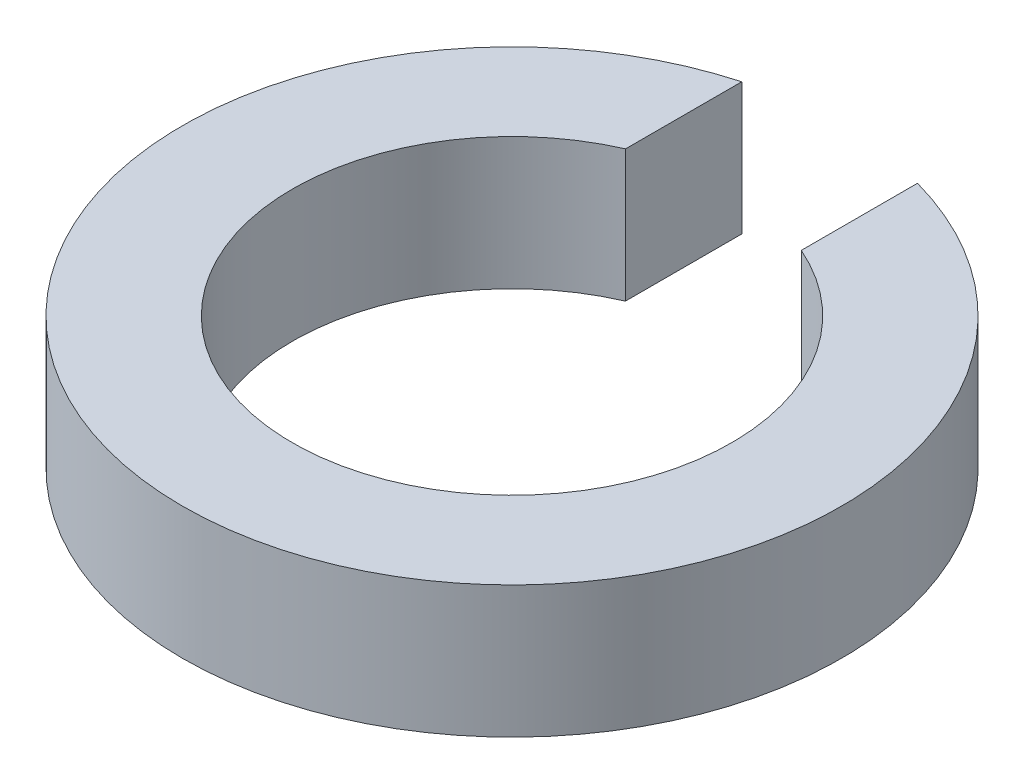
ISO-10303-21;
HEADER;
FILE_DESCRIPTION(('STEP AP214'),'2;1');
FILE_NAME('part.step','',(''),(''),'','','');
FILE_SCHEMA(('AUTOMOTIVE_DESIGN { 1 0 10303 214 1 1 1 1 }'));
ENDSEC;
DATA;
#1=APPLICATION_CONTEXT('core data for automotive mechanical design processes');
#2=APPLICATION_PROTOCOL_DEFINITION('international standard','automotive_design',2000,#1);
#3=PRODUCT_CONTEXT('',#1,'mechanical');
#4=PRODUCT('Part','Part','',(#3));
#5=PRODUCT_RELATED_PRODUCT_CATEGORY('part','',(#4));
#6=PRODUCT_DEFINITION_FORMATION('','',#4);
#7=PRODUCT_DEFINITION_CONTEXT('part definition',#1,'design');
#8=PRODUCT_DEFINITION('design','',#6,#7);
#9=PRODUCT_DEFINITION_SHAPE('','',#8);
#10=(LENGTH_UNIT() NAMED_UNIT(*) SI_UNIT(.MILLI.,.METRE.));
#11=(NAMED_UNIT(*) PLANE_ANGLE_UNIT() SI_UNIT($,.RADIAN.));
#12=(NAMED_UNIT(*) SI_UNIT($,.STERADIAN.) SOLID_ANGLE_UNIT());
#13=UNCERTAINTY_MEASURE_WITH_UNIT(LENGTH_MEASURE(1.E-05),#10,'distance_accuracy_value','');
#14=(GEOMETRIC_REPRESENTATION_CONTEXT(3) GLOBAL_UNCERTAINTY_ASSIGNED_CONTEXT((#13)) GLOBAL_UNIT_ASSIGNED_CONTEXT((#10,
#11,#12)) REPRESENTATION_CONTEXT('',''));
#15=CARTESIAN_POINT('',(0.,0.,0.));
#16=DIRECTION('',(0.,0.,1.));
#17=DIRECTION('',(1.,0.,0.));
#18=AXIS2_PLACEMENT_3D('',#15,#16,#17);
#19=CARTESIAN_POINT('',(0.,3.,0.));
#20=DIRECTION('',(0.,1.,0.));
#21=DIRECTION('',(0.,0.,1.));
#22=AXIS2_PLACEMENT_3D('',#19,#20,#21);
#23=PLANE('',#22);
#24=DIRECTION('',(0.,0.,-1.));
#25=VECTOR('',#24,1.);
#26=CARTESIAN_POINT('',(2.,3.,-7.94230657639372));
#27=LINE('',#26,#25);
#28=CARTESIAN_POINT('',(1.99999999999999,3.,-4.58257569495585));
#29=VERTEX_POINT('',#28);
#30=CARTESIAN_POINT('',(2.,3.,-7.22841614740048));
#31=VERTEX_POINT('',#30);
#32=EDGE_CURVE('E91',#29,#31,#27,.T.);
#33=ORIENTED_EDGE('',*,*,#32,.F.);
#34=CARTESIAN_POINT('',(0.,3.,0.));
#35=DIRECTION('',(0.,1.,0.));
#36=DIRECTION('',(0.,0.,1.));
#37=AXIS2_PLACEMENT_3D('',#34,#35,#36);
#38=CIRCLE('',#37,5.);
#39=CARTESIAN_POINT('',(-2.,3.,-4.58257569495584));
#40=VERTEX_POINT('',#39);
#41=EDGE_CURVE('E90',#40,#29,#38,.T.);
#42=ORIENTED_EDGE('',*,*,#41,.F.);
#43=DIRECTION('',(0.,0.,1.));
#44=VECTOR('',#43,1.);
#45=CARTESIAN_POINT('',(-2.,3.,-7.94230657639372));
#46=LINE('',#45,#44);
#47=CARTESIAN_POINT('',(-2.,3.,-7.22841614740048));
#48=VERTEX_POINT('',#47);
#49=EDGE_CURVE('E59',#48,#40,#46,.T.);
#50=ORIENTED_EDGE('',*,*,#49,.F.);
#51=CARTESIAN_POINT('',(0.,3.,0.));
#52=DIRECTION('',(0.,1.,0.));
#53=DIRECTION('',(0.,0.,1.));
#54=AXIS2_PLACEMENT_3D('',#51,#52,#53);
#55=CIRCLE('',#54,7.5);
#56=EDGE_CURVE('E88',#48,#31,#55,.T.);
#57=ORIENTED_EDGE('',*,*,#56,.T.);
#58=EDGE_LOOP('',(#33,#42,#50,#57));
#59=FACE_BOUND('',#58,.T.);
#60=ADVANCED_FACE('F37',(#59),#23,.T.);
#61=CARTESIAN_POINT('',(0.,0.,0.));
#62=DIRECTION('',(0.,1.,0.));
#63=DIRECTION('',(0.,0.,1.));
#64=AXIS2_PLACEMENT_3D('',#61,#62,#63);
#65=PLANE('',#64);
#66=CARTESIAN_POINT('',(0.,0.,0.));
#67=DIRECTION('',(0.,1.,0.));
#68=DIRECTION('',(0.,0.,1.));
#69=AXIS2_PLACEMENT_3D('',#66,#67,#68);
#70=CIRCLE('',#69,5.);
#71=CARTESIAN_POINT('',(-2.,0.,-4.58257569495584));
#72=VERTEX_POINT('',#71);
#73=CARTESIAN_POINT('',(1.99999999999999,0.,-4.58257569495585));
#74=VERTEX_POINT('',#73);
#75=EDGE_CURVE('E99',#72,#74,#70,.T.);
#76=ORIENTED_EDGE('',*,*,#75,.T.);
#77=DIRECTION('',(0.,0.,-1.));
#78=VECTOR('',#77,1.);
#79=CARTESIAN_POINT('',(1.99999999999997,0.,0.));
#80=LINE('',#79,#78);
#81=CARTESIAN_POINT('',(2.,0.,-7.22841614740048));
#82=VERTEX_POINT('',#81);
#83=EDGE_CURVE('E51',#74,#82,#80,.T.);
#84=ORIENTED_EDGE('',*,*,#83,.T.);
#85=CARTESIAN_POINT('',(0.,0.,0.));
#86=DIRECTION('',(0.,1.,0.));
#87=DIRECTION('',(0.,0.,1.));
#88=AXIS2_PLACEMENT_3D('',#85,#86,#87);
#89=CIRCLE('',#88,7.5);
#90=CARTESIAN_POINT('',(-2.,0.,-7.22841614740048));
#91=VERTEX_POINT('',#90);
#92=EDGE_CURVE('E95',#91,#82,#89,.T.);
#93=ORIENTED_EDGE('',*,*,#92,.F.);
#94=DIRECTION('',(0.,0.,1.));
#95=VECTOR('',#94,1.);
#96=CARTESIAN_POINT('',(-2.00000000000001,0.,0.));
#97=LINE('',#96,#95);
#98=EDGE_CURVE('E78',#91,#72,#97,.T.);
#99=ORIENTED_EDGE('',*,*,#98,.T.);
#100=EDGE_LOOP('',(#76,#84,#93,#99));
#101=FACE_BOUND('',#100,.T.);
#102=ADVANCED_FACE('F111',(#101),#65,.F.);
#103=CARTESIAN_POINT('',(0.,3.,0.));
#104=DIRECTION('',(0.,-1.,0.));
#105=DIRECTION('',(0.,0.,-1.));
#106=AXIS2_PLACEMENT_3D('',#103,#104,#105);
#107=CYLINDRICAL_SURFACE('',#106,7.5);
#108=ORIENTED_EDGE('',*,*,#92,.T.);
#109=DIRECTION('',(0.,-1.,0.));
#110=VECTOR('',#109,1.);
#111=CARTESIAN_POINT('',(2.,3.,-7.22841614740048));
#112=LINE('',#111,#110);
#113=EDGE_CURVE('E94',#82,#31,#112,.F.);
#114=ORIENTED_EDGE('',*,*,#113,.T.);
#115=ORIENTED_EDGE('',*,*,#56,.F.);
#116=DIRECTION('',(0.,-1.,0.));
#117=VECTOR('',#116,1.);
#118=CARTESIAN_POINT('',(-2.,3.,-7.22841614740048));
#119=LINE('',#118,#117);
#120=EDGE_CURVE('E75',#48,#91,#119,.T.);
#121=ORIENTED_EDGE('',*,*,#120,.T.);
#122=EDGE_LOOP('',(#108,#114,#115,#121));
#123=FACE_BOUND('',#122,.T.);
#124=ADVANCED_FACE('F39',(#123),#107,.T.);
#125=CARTESIAN_POINT('',(0.,3.,0.));
#126=DIRECTION('',(0.,-1.,0.));
#127=DIRECTION('',(0.,0.,-1.));
#128=AXIS2_PLACEMENT_3D('',#125,#126,#127);
#129=CYLINDRICAL_SURFACE('',#128,5.);
#130=DIRECTION('',(0.,-1.,0.));
#131=VECTOR('',#130,1.);
#132=CARTESIAN_POINT('',(1.99999999999999,3.,-4.58257569495585));
#133=LINE('',#132,#131);
#134=EDGE_CURVE('E11',#74,#29,#133,.F.);
#135=ORIENTED_EDGE('',*,*,#134,.F.);
#136=ORIENTED_EDGE('',*,*,#75,.F.);
#137=DIRECTION('',(0.,-1.,0.));
#138=VECTOR('',#137,1.);
#139=CARTESIAN_POINT('',(-2.,3.,-4.58257569495584));
#140=LINE('',#139,#138);
#141=EDGE_CURVE('E45',#40,#72,#140,.T.);
#142=ORIENTED_EDGE('',*,*,#141,.F.);
#143=ORIENTED_EDGE('',*,*,#41,.T.);
#144=EDGE_LOOP('',(#135,#136,#142,#143));
#145=FACE_BOUND('',#144,.T.);
#146=ADVANCED_FACE('F108',(#145),#129,.F.);
#147=CARTESIAN_POINT('',(-2.,-0.5,-7.94230657639372));
#148=DIRECTION('',(-1.,0.,0.));
#149=DIRECTION('',(0.,0.,1.));
#150=AXIS2_PLACEMENT_3D('',#147,#148,#149);
#151=PLANE('',#150);
#152=ORIENTED_EDGE('',*,*,#49,.T.);
#153=ORIENTED_EDGE('',*,*,#141,.T.);
#154=ORIENTED_EDGE('',*,*,#98,.F.);
#155=ORIENTED_EDGE('',*,*,#120,.F.);
#156=EDGE_LOOP('',(#152,#153,#154,#155));
#157=FACE_BOUND('',#156,.T.);
#158=ADVANCED_FACE('F76',(#157),#151,.F.);
#159=CARTESIAN_POINT('',(2.,-0.5,-7.94230657639372));
#160=DIRECTION('',(1.,0.,0.));
#161=DIRECTION('',(0.,0.,-1.));
#162=AXIS2_PLACEMENT_3D('',#159,#160,#161);
#163=PLANE('',#162);
#164=ORIENTED_EDGE('',*,*,#83,.F.);
#165=ORIENTED_EDGE('',*,*,#134,.T.);
#166=ORIENTED_EDGE('',*,*,#32,.T.);
#167=ORIENTED_EDGE('',*,*,#113,.F.);
#168=EDGE_LOOP('',(#164,#165,#166,#167));
#169=FACE_BOUND('',#168,.T.);
#170=ADVANCED_FACE('F106',(#169),#163,.F.);
#171=CLOSED_SHELL('',(#60,#102,#124,#146,#158,#170));
#172=MANIFOLD_SOLID_BREP('B2',#171);
#173=ADVANCED_BREP_SHAPE_REPRESENTATION('',(#18,#172),#14);
#174=SHAPE_DEFINITION_REPRESENTATION(#9,#173);
ENDSEC;
END-ISO-10303-21;
